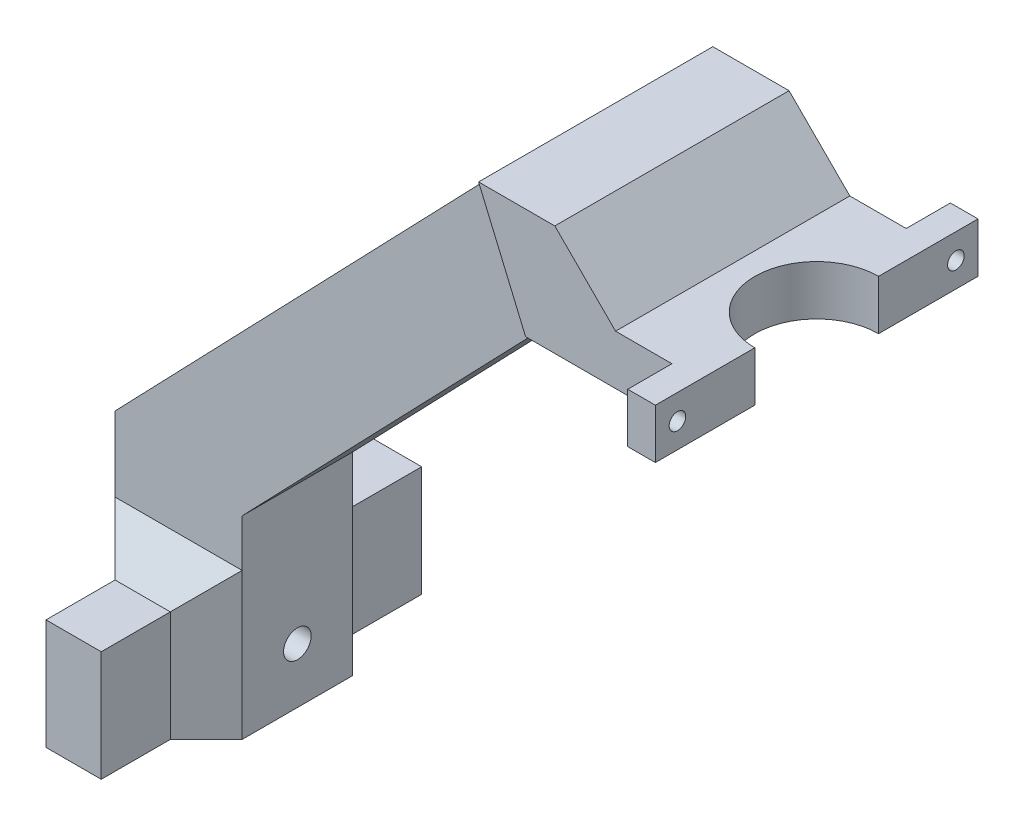
ISO-10303-21;
HEADER;
FILE_DESCRIPTION(('STEP AP214'),'2;1');
FILE_NAME('part.step','',(''),(''),'','','');
FILE_SCHEMA(('AUTOMOTIVE_DESIGN { 1 0 10303 214 1 1 1 1 }'));
ENDSEC;
DATA;
#1=APPLICATION_CONTEXT('core data for automotive mechanical design processes');
#2=APPLICATION_PROTOCOL_DEFINITION('international standard','automotive_design',2000,#1);
#3=PRODUCT_CONTEXT('',#1,'mechanical');
#4=PRODUCT('Part','Part','',(#3));
#5=PRODUCT_RELATED_PRODUCT_CATEGORY('part','',(#4));
#6=PRODUCT_DEFINITION_FORMATION('','',#4);
#7=PRODUCT_DEFINITION_CONTEXT('part definition',#1,'design');
#8=PRODUCT_DEFINITION('design','',#6,#7);
#9=PRODUCT_DEFINITION_SHAPE('','',#8);
#10=(LENGTH_UNIT() NAMED_UNIT(*) SI_UNIT(.MILLI.,.METRE.));
#11=(NAMED_UNIT(*) PLANE_ANGLE_UNIT() SI_UNIT($,.RADIAN.));
#12=(NAMED_UNIT(*) SI_UNIT($,.STERADIAN.) SOLID_ANGLE_UNIT());
#13=UNCERTAINTY_MEASURE_WITH_UNIT(LENGTH_MEASURE(1.E-05),#10,'distance_accuracy_value','');
#14=(GEOMETRIC_REPRESENTATION_CONTEXT(3) GLOBAL_UNCERTAINTY_ASSIGNED_CONTEXT((#13)) GLOBAL_UNIT_ASSIGNED_CONTEXT((#10,
#11,#12)) REPRESENTATION_CONTEXT('',''));
#15=CARTESIAN_POINT('',(0.,0.,0.));
#16=DIRECTION('',(0.,0.,1.));
#17=DIRECTION('',(1.,0.,0.));
#18=AXIS2_PLACEMENT_3D('',#15,#16,#17);
#19=CARTESIAN_POINT('',(0.,0.,-14.224));
#20=DIRECTION('',(0.,0.,1.));
#21=DIRECTION('',(1.,0.,0.));
#22=AXIS2_PLACEMENT_3D('',#19,#20,#21);
#23=PLANE('',#22);
#24=DIRECTION('',(0.,1.,0.));
#25=VECTOR('',#24,1.);
#26=CARTESIAN_POINT('',(44.45,-13.97,-14.224));
#27=LINE('',#26,#25);
#28=CARTESIAN_POINT('',(44.45,-25.4,-14.224));
#29=VERTEX_POINT('',#28);
#30=CARTESIAN_POINT('',(44.45,-13.97,-14.224));
#31=VERTEX_POINT('',#30);
#32=EDGE_CURVE('E66',#29,#31,#27,.T.);
#33=ORIENTED_EDGE('',*,*,#32,.F.);
#34=DIRECTION('',(1.,0.,0.));
#35=VECTOR('',#34,1.);
#36=CARTESIAN_POINT('',(50.8,-25.4,-14.224));
#37=LINE('',#36,#35);
#38=CARTESIAN_POINT('',(10.806439584818,-25.4,-14.224));
#39=VERTEX_POINT('',#38);
#40=EDGE_CURVE('E361',#39,#29,#37,.T.);
#41=ORIENTED_EDGE('',*,*,#40,.F.);
#42=DIRECTION('',(0.391491636974054,-0.920181665857007,0.));
#43=VECTOR('',#42,1.);
#44=CARTESIAN_POINT('',(0.,0.,-14.224));
#45=LINE('',#44,#43);
#46=CARTESIAN_POINT('',(0.,0.,-14.224));
#47=VERTEX_POINT('',#46);
#48=EDGE_CURVE('E357',#47,#39,#45,.T.);
#49=ORIENTED_EDGE('',*,*,#48,.F.);
#50=DIRECTION('',(-1.,0.,0.));
#51=VECTOR('',#50,1.);
#52=CARTESIAN_POINT('',(50.8,0.,-14.224));
#53=LINE('',#52,#51);
#54=CARTESIAN_POINT('',(17.526,0.,-14.224));
#55=VERTEX_POINT('',#54);
#56=EDGE_CURVE('E354',#55,#47,#53,.T.);
#57=ORIENTED_EDGE('',*,*,#56,.F.);
#58=DIRECTION('',(0.707106781186551,-0.707106781186544,0.));
#59=VECTOR('',#58,1.);
#60=CARTESIAN_POINT('',(8.7629999999999,8.76299999999999,-14.224));
#61=LINE('',#60,#59);
#62=CARTESIAN_POINT('',(31.4960000000001,-13.97,-14.224));
#63=VERTEX_POINT('',#62);
#64=EDGE_CURVE('E552',#55,#63,#61,.T.);
#65=ORIENTED_EDGE('',*,*,#64,.T.);
#66=DIRECTION('',(-1.,0.,0.));
#67=VECTOR('',#66,1.);
#68=CARTESIAN_POINT('',(50.8,-13.97,-14.224));
#69=LINE('',#68,#67);
#70=EDGE_CURVE('E324',#31,#63,#69,.T.);
#71=ORIENTED_EDGE('',*,*,#70,.F.);
#72=EDGE_LOOP('',(#33,#41,#49,#57,#65,#71));
#73=FACE_BOUND('',#72,.T.);
#74=ADVANCED_FACE('F47',(#73),#23,.F.);
#75=CARTESIAN_POINT('',(50.8,0.,25.4));
#76=DIRECTION('',(-1.,0.,0.));
#77=DIRECTION('',(0.,0.,1.));
#78=AXIS2_PLACEMENT_3D('',#75,#76,#77);
#79=PLANE('',#78);
#80=CARTESIAN_POINT('',(50.8,-19.685,44.704));
#81=DIRECTION('',(1.,0.,0.));
#82=DIRECTION('',(0.,0.,-1.));
#83=AXIS2_PLACEMENT_3D('',#80,#81,#82);
#84=CIRCLE('',#83,1.905);
#85=CARTESIAN_POINT('',(50.8,-19.685,42.799));
#86=VERTEX_POINT('',#85);
#87=EDGE_CURVE('E583',#86,#86,#84,.T.);
#88=ORIENTED_EDGE('',*,*,#87,.F.);
#89=EDGE_LOOP('',(#88));
#90=FACE_BOUND('',#89,.T.);
#91=DIRECTION('',(0.,0.,-1.));
#92=VECTOR('',#91,1.);
#93=CARTESIAN_POINT('',(50.8,-13.97,39.624));
#94=LINE('',#93,#92);
#95=CARTESIAN_POINT('',(50.8,-13.97,49.784));
#96=VERTEX_POINT('',#95);
#97=CARTESIAN_POINT('',(50.8,-13.97,26.924));
#98=VERTEX_POINT('',#97);
#99=EDGE_CURVE('E321',#96,#98,#94,.T.);
#100=ORIENTED_EDGE('',*,*,#99,.F.);
#101=DIRECTION('',(0.,1.,0.));
#102=VECTOR('',#101,1.);
#103=CARTESIAN_POINT('',(50.8,-13.97,49.784));
#104=LINE('',#103,#102);
#105=CARTESIAN_POINT('',(50.8,-25.4,49.784));
#106=VERTEX_POINT('',#105);
#107=EDGE_CURVE('E296',#106,#96,#104,.T.);
#108=ORIENTED_EDGE('',*,*,#107,.F.);
#109=DIRECTION('',(0.,0.,-1.));
#110=VECTOR('',#109,1.);
#111=CARTESIAN_POINT('',(50.8,-25.4,25.4));
#112=LINE('',#111,#110);
#113=CARTESIAN_POINT('',(50.8,-25.4,26.924));
#114=VERTEX_POINT('',#113);
#115=EDGE_CURVE('E261',#106,#114,#112,.T.);
#116=ORIENTED_EDGE('',*,*,#115,.T.);
#117=DIRECTION('',(0.,1.,0.));
#118=VECTOR('',#117,1.);
#119=CARTESIAN_POINT('',(50.8,-152.4,26.924));
#120=LINE('',#119,#118);
#121=EDGE_CURVE('E339',#114,#98,#120,.T.);
#122=ORIENTED_EDGE('',*,*,#121,.T.);
#123=EDGE_LOOP('',(#100,#108,#116,#122));
#124=FACE_BOUND('',#123,.T.);
#125=ADVANCED_FACE('F601',(#90,#124),#79,.F.);
#126=CARTESIAN_POINT('',(50.8,-19.685,-19.304));
#127=DIRECTION('',(1.,0.,0.));
#128=DIRECTION('',(0.,0.,-1.));
#129=AXIS2_PLACEMENT_3D('',#126,#127,#128);
#130=CIRCLE('',#129,1.905);
#131=CARTESIAN_POINT('',(50.8,-19.685,-21.209));
#132=VERTEX_POINT('',#131);
#133=EDGE_CURVE('E283',#132,#132,#130,.T.);
#134=ORIENTED_EDGE('',*,*,#133,.F.);
#135=EDGE_LOOP('',(#134));
#136=FACE_BOUND('',#135,.T.);
#137=CARTESIAN_POINT('',(50.8,-13.97,-1.524));
#138=VERTEX_POINT('',#137);
#139=CARTESIAN_POINT('',(50.8,-13.97,-24.384));
#140=VERTEX_POINT('',#139);
#141=EDGE_CURVE('E325',#138,#140,#94,.T.);
#142=ORIENTED_EDGE('',*,*,#141,.F.);
#143=DIRECTION('',(0.,1.,0.));
#144=VECTOR('',#143,1.);
#145=CARTESIAN_POINT('',(50.8,-152.4,-1.524));
#146=LINE('',#145,#144);
#147=CARTESIAN_POINT('',(50.8,-25.4,-1.524));
#148=VERTEX_POINT('',#147);
#149=EDGE_CURVE('E256',#138,#148,#146,.F.);
#150=ORIENTED_EDGE('',*,*,#149,.T.);
#151=CARTESIAN_POINT('',(50.8,-25.4,-24.384));
#152=VERTEX_POINT('',#151);
#153=EDGE_CURVE('E249',#148,#152,#112,.T.);
#154=ORIENTED_EDGE('',*,*,#153,.T.);
#155=DIRECTION('',(0.,-1.,0.));
#156=VECTOR('',#155,1.);
#157=CARTESIAN_POINT('',(50.8,-13.97,-24.384));
#158=LINE('',#157,#156);
#159=EDGE_CURVE('E254',#140,#152,#158,.T.);
#160=ORIENTED_EDGE('',*,*,#159,.F.);
#161=EDGE_LOOP('',(#142,#150,#154,#160));
#162=FACE_BOUND('',#161,.T.);
#163=ADVANCED_FACE('F252',(#136,#162),#79,.F.);
#164=CARTESIAN_POINT('',(50.8,-152.4,12.7));
#165=DIRECTION('',(0.,1.,0.));
#166=DIRECTION('',(0.,0.,1.));
#167=AXIS2_PLACEMENT_3D('',#164,#165,#166);
#168=CYLINDRICAL_SURFACE('',#167,14.224);
#169=CARTESIAN_POINT('',(50.8,-13.97,12.7));
#170=DIRECTION('',(0.,1.,0.));
#171=DIRECTION('',(0.,0.,1.));
#172=AXIS2_PLACEMENT_3D('',#169,#170,#171);
#173=CIRCLE('',#172,14.224);
#174=EDGE_CURVE('E530',#98,#138,#173,.F.);
#175=ORIENTED_EDGE('',*,*,#174,.F.);
#176=ORIENTED_EDGE('',*,*,#121,.F.);
#177=CARTESIAN_POINT('',(50.8,-25.4,12.7));
#178=DIRECTION('',(0.,1.,0.));
#179=DIRECTION('',(-1.,0.,0.));
#180=AXIS2_PLACEMENT_3D('',#177,#178,#179);
#181=CIRCLE('',#180,14.224);
#182=EDGE_CURVE('E336',#148,#114,#181,.T.);
#183=ORIENTED_EDGE('',*,*,#182,.F.);
#184=ORIENTED_EDGE('',*,*,#149,.F.);
#185=EDGE_LOOP('',(#175,#176,#183,#184));
#186=FACE_BOUND('',#185,.T.);
#187=ADVANCED_FACE('F600',(#186),#168,.F.);
#188=CARTESIAN_POINT('',(-97.79,-101.6,25.4));
#189=DIRECTION('',(0.720486853359742,-0.693468596358752,0.));
#190=DIRECTION('',(0.693468596358752,0.720486853359742,0.));
#191=AXIS2_PLACEMENT_3D('',#188,#189,#190);
#192=PLANE('',#191);
#193=DIRECTION('',(0.,0.,-1.));
#194=VECTOR('',#193,1.);
#195=CARTESIAN_POINT('',(0.,0.,25.4));
#196=LINE('',#195,#194);
#197=CARTESIAN_POINT('',(0.,0.,39.37));
#198=VERTEX_POINT('',#197);
#199=CARTESIAN_POINT('',(0.,0.,-13.9700000000001));
#200=VERTEX_POINT('',#199);
#201=EDGE_CURVE('E262',#198,#200,#196,.T.);
#202=ORIENTED_EDGE('',*,*,#201,.T.);
#203=DIRECTION('',(0.510298851999777,0.530180625454313,-0.677128928669115));
#204=VECTOR('',#203,1.);
#205=CARTESIAN_POINT('',(-66.5567699068968,-69.1498908123603,74.3459233576985));
#206=LINE('',#205,#204);
#207=CARTESIAN_POINT('',(-10.5280909744155,-10.938276337055,0.));
#208=VERTEX_POINT('',#207);
#209=EDGE_CURVE('E571',#200,#208,#206,.F.);
#210=ORIENTED_EDGE('',*,*,#209,.T.);
#211=DIRECTION('',(-0.693468596358752,-0.720486853359742,0.));
#212=VECTOR('',#211,1.);
#213=CARTESIAN_POINT('',(-97.79,-101.6,0.));
#214=LINE('',#213,#212);
#215=CARTESIAN_POINT('',(-97.79,-101.6,0.));
#216=VERTEX_POINT('',#215);
#217=EDGE_CURVE('E418',#208,#216,#214,.T.);
#218=ORIENTED_EDGE('',*,*,#217,.T.);
#219=DIRECTION('',(0.,0.,-1.));
#220=VECTOR('',#219,1.);
#221=CARTESIAN_POINT('',(-97.79,-101.6,25.4));
#222=LINE('',#221,#220);
#223=CARTESIAN_POINT('',(-97.79,-101.6,25.4));
#224=VERTEX_POINT('',#223);
#225=EDGE_CURVE('E486',#224,#216,#222,.T.);
#226=ORIENTED_EDGE('',*,*,#225,.F.);
#227=DIRECTION('',(-0.693468596358752,-0.720486853359742,0.));
#228=VECTOR('',#227,1.);
#229=CARTESIAN_POINT('',(-97.79,-101.6,25.4));
#230=LINE('',#229,#228);
#231=CARTESIAN_POINT('',(-10.5280909744156,-10.9382763370552,25.4));
#232=VERTEX_POINT('',#231);
#233=EDGE_CURVE('E434',#232,#224,#230,.T.);
#234=ORIENTED_EDGE('',*,*,#233,.F.);
#235=DIRECTION('',(0.510298851999781,0.530180625454318,0.677128928669108));
#236=VECTOR('',#235,1.);
#237=CARTESIAN_POINT('',(-57.7801017870232,-60.0312745839202,-37.2999322722675));
#238=LINE('',#237,#236);
#239=EDGE_CURVE('E58',#232,#198,#238,.T.);
#240=ORIENTED_EDGE('',*,*,#239,.T.);
#241=EDGE_LOOP('',(#202,#210,#218,#226,#234,#240));
#242=FACE_BOUND('',#241,.T.);
#243=ADVANCED_FACE('F608',(#242),#192,.F.);
#244=CARTESIAN_POINT('',(-97.79,-101.6,25.4));
#245=DIRECTION('',(1.,0.,0.));
#246=DIRECTION('',(0.,1.,0.));
#247=AXIS2_PLACEMENT_3D('',#244,#245,#246);
#248=PLANE('',#247);
#249=CARTESIAN_POINT('',(-97.79,-139.7,12.7));
#250=DIRECTION('',(-1.,0.,0.));
#251=DIRECTION('',(0.,0.,1.));
#252=AXIS2_PLACEMENT_3D('',#249,#250,#251);
#253=CIRCLE('',#252,3.175);
#254=CARTESIAN_POINT('',(-97.79,-139.7,15.875));
#255=VERTEX_POINT('',#254);
#256=EDGE_CURVE('E375',#255,#255,#253,.T.);
#257=ORIENTED_EDGE('',*,*,#256,.F.);
#258=EDGE_LOOP('',(#257));
#259=FACE_BOUND('',#258,.T.);
#260=DIRECTION('',(0.,-1.,0.));
#261=VECTOR('',#260,1.);
#262=CARTESIAN_POINT('',(-97.79,-101.6,0.));
#263=LINE('',#262,#261);
#264=CARTESIAN_POINT('',(-97.79,-118.745,0.));
#265=VERTEX_POINT('',#264);
#266=EDGE_CURVE('E455',#216,#265,#263,.T.);
#267=ORIENTED_EDGE('',*,*,#266,.T.);
#268=CARTESIAN_POINT('',(-97.79,-152.4,0.));
#269=VERTEX_POINT('',#268);
#270=EDGE_CURVE('E454',#265,#269,#263,.T.);
#271=ORIENTED_EDGE('',*,*,#270,.T.);
#272=DIRECTION('',(0.,0.,-1.));
#273=VECTOR('',#272,1.);
#274=CARTESIAN_POINT('',(-97.79,-152.4,25.4));
#275=LINE('',#274,#273);
#276=CARTESIAN_POINT('',(-97.79,-152.4,25.4));
#277=VERTEX_POINT('',#276);
#278=EDGE_CURVE('E482',#277,#269,#275,.T.);
#279=ORIENTED_EDGE('',*,*,#278,.F.);
#280=DIRECTION('',(0.,-1.,0.));
#281=VECTOR('',#280,1.);
#282=CARTESIAN_POINT('',(-97.79,-101.6,25.4));
#283=LINE('',#282,#281);
#284=CARTESIAN_POINT('',(-97.79,-118.745,25.4));
#285=VERTEX_POINT('',#284);
#286=EDGE_CURVE('E437',#285,#277,#283,.T.);
#287=ORIENTED_EDGE('',*,*,#286,.F.);
#288=EDGE_CURVE('E439',#224,#285,#283,.T.);
#289=ORIENTED_EDGE('',*,*,#288,.F.);
#290=ORIENTED_EDGE('',*,*,#225,.T.);
#291=EDGE_LOOP('',(#267,#271,#279,#287,#289,#290));
#292=FACE_BOUND('',#291,.T.);
#293=ADVANCED_FACE('F696',(#259,#292),#248,.F.);
#294=CARTESIAN_POINT('',(-97.79,-152.4,25.4));
#295=DIRECTION('',(0.,1.,0.));
#296=DIRECTION('',(0.,0.,1.));
#297=AXIS2_PLACEMENT_3D('',#294,#295,#296);
#298=PLANE('',#297);
#299=DIRECTION('',(0.,0.,-1.));
#300=VECTOR('',#299,1.);
#301=CARTESIAN_POINT('',(-68.58,-152.4,25.4));
#302=LINE('',#301,#300);
#303=CARTESIAN_POINT('',(-68.58,-152.4,25.4));
#304=VERTEX_POINT('',#303);
#305=CARTESIAN_POINT('',(-68.58,-152.4,0.));
#306=VERTEX_POINT('',#305);
#307=EDGE_CURVE('E478',#304,#306,#302,.T.);
#308=ORIENTED_EDGE('',*,*,#307,.F.);
#309=DIRECTION('',(-0.707106781186552,0.,0.707106781186543));
#310=VECTOR('',#309,1.);
#311=CARTESIAN_POINT('',(-83.1850000000001,-152.4,40.005));
#312=LINE('',#311,#310);
#313=CARTESIAN_POINT('',(-76.835,-152.4,33.655));
#314=VERTEX_POINT('',#313);
#315=EDGE_CURVE('E521',#304,#314,#312,.T.);
#316=ORIENTED_EDGE('',*,*,#315,.T.);
#317=DIRECTION('',(0.,0.,1.));
#318=VECTOR('',#317,1.);
#319=CARTESIAN_POINT('',(-76.835,-152.4,-24.13));
#320=LINE('',#319,#318);
#321=CARTESIAN_POINT('',(-76.835,-152.4,49.53));
#322=VERTEX_POINT('',#321);
#323=EDGE_CURVE('E429',#314,#322,#320,.T.);
#324=ORIENTED_EDGE('',*,*,#323,.T.);
#325=DIRECTION('',(1.,0.,0.));
#326=VECTOR('',#325,1.);
#327=CARTESIAN_POINT('',(-89.535,-152.4,49.53));
#328=LINE('',#327,#326);
#329=CARTESIAN_POINT('',(-89.535,-152.4,49.53));
#330=VERTEX_POINT('',#329);
#331=EDGE_CURVE('E385',#330,#322,#328,.T.);
#332=ORIENTED_EDGE('',*,*,#331,.F.);
#333=DIRECTION('',(0.,0.,1.));
#334=VECTOR('',#333,1.);
#335=CARTESIAN_POINT('',(-89.535,-152.4,-24.13));
#336=LINE('',#335,#334);
#337=CARTESIAN_POINT('',(-89.535,-152.4,33.655));
#338=VERTEX_POINT('',#337);
#339=EDGE_CURVE('E413',#338,#330,#336,.T.);
#340=ORIENTED_EDGE('',*,*,#339,.F.);
#341=DIRECTION('',(-0.707106781186551,0.,-0.707106781186544));
#342=VECTOR('',#341,1.);
#343=CARTESIAN_POINT('',(-97.79,-152.4,25.4));
#344=LINE('',#343,#342);
#345=EDGE_CURVE('E518',#338,#277,#344,.T.);
#346=ORIENTED_EDGE('',*,*,#345,.T.);
#347=ORIENTED_EDGE('',*,*,#278,.T.);
#348=DIRECTION('',(-0.707106781186543,0.,0.707106781186552));
#349=VECTOR('',#348,1.);
#350=CARTESIAN_POINT('',(-110.49,-152.4,12.7000000000002));
#351=LINE('',#350,#349);
#352=CARTESIAN_POINT('',(-89.535,-152.4,-8.25500000000007));
#353=VERTEX_POINT('',#352);
#354=EDGE_CURVE('E524',#269,#353,#351,.F.);
#355=ORIENTED_EDGE('',*,*,#354,.T.);
#356=CARTESIAN_POINT('',(-89.535,-152.4,-24.13));
#357=VERTEX_POINT('',#356);
#358=EDGE_CURVE('E430',#357,#353,#336,.T.);
#359=ORIENTED_EDGE('',*,*,#358,.F.);
#360=DIRECTION('',(1.,0.,0.));
#361=VECTOR('',#360,1.);
#362=CARTESIAN_POINT('',(-89.535,-152.4,-24.13));
#363=LINE('',#362,#361);
#364=CARTESIAN_POINT('',(-76.835,-152.4,-24.13));
#365=VERTEX_POINT('',#364);
#366=EDGE_CURVE('E401',#357,#365,#363,.T.);
#367=ORIENTED_EDGE('',*,*,#366,.T.);
#368=CARTESIAN_POINT('',(-76.835,-152.4,-8.25500000000007));
#369=VERTEX_POINT('',#368);
#370=EDGE_CURVE('E425',#365,#369,#320,.T.);
#371=ORIENTED_EDGE('',*,*,#370,.T.);
#372=DIRECTION('',(-0.707106781186543,0.,-0.707106781186552));
#373=VECTOR('',#372,1.);
#374=CARTESIAN_POINT('',(-70.4849999999999,-152.4,-1.90499999999983));
#375=LINE('',#374,#373);
#376=EDGE_CURVE('E527',#369,#306,#375,.F.);
#377=ORIENTED_EDGE('',*,*,#376,.T.);
#378=EDGE_LOOP('',(#308,#316,#324,#332,#340,#346,#347,#355,#359,#367,#371,#377));
#379=FACE_BOUND('',#378,.T.);
#380=ADVANCED_FACE('F885',(#379),#298,.F.);
#381=CARTESIAN_POINT('',(-68.58,-152.4,25.4));
#382=DIRECTION('',(-1.,0.,0.));
#383=DIRECTION('',(0.,0.,1.));
#384=AXIS2_PLACEMENT_3D('',#381,#382,#383);
#385=PLANE('',#384);
#386=CARTESIAN_POINT('',(-68.58,-139.7,12.7));
#387=DIRECTION('',(-1.,0.,0.));
#388=DIRECTION('',(0.,0.,1.));
#389=AXIS2_PLACEMENT_3D('',#386,#387,#388);
#390=CIRCLE('',#389,3.175);
#391=CARTESIAN_POINT('',(-68.58,-139.7,15.875));
#392=VERTEX_POINT('',#391);
#393=EDGE_CURVE('E379',#392,#392,#390,.T.);
#394=ORIENTED_EDGE('',*,*,#393,.T.);
#395=EDGE_LOOP('',(#394));
#396=FACE_BOUND('',#395,.T.);
#397=DIRECTION('',(0.,1.,0.));
#398=VECTOR('',#397,1.);
#399=CARTESIAN_POINT('',(-68.58,-152.4,0.));
#400=LINE('',#399,#398);
#401=CARTESIAN_POINT('',(-68.58,-118.745,0.));
#402=VERTEX_POINT('',#401);
#403=EDGE_CURVE('E460',#306,#402,#400,.T.);
#404=ORIENTED_EDGE('',*,*,#403,.T.);
#405=CARTESIAN_POINT('',(-68.58,-107.87941775046,0.));
#406=VERTEX_POINT('',#405);
#407=EDGE_CURVE('E459',#402,#406,#400,.T.);
#408=ORIENTED_EDGE('',*,*,#407,.T.);
#409=DIRECTION('',(0.,0.,-1.));
#410=VECTOR('',#409,1.);
#411=CARTESIAN_POINT('',(-68.58,-107.87941775046,25.4));
#412=LINE('',#411,#410);
#413=CARTESIAN_POINT('',(-68.58,-107.87941775046,25.4));
#414=VERTEX_POINT('',#413);
#415=EDGE_CURVE('E474',#414,#406,#412,.T.);
#416=ORIENTED_EDGE('',*,*,#415,.F.);
#417=DIRECTION('',(0.,1.,0.));
#418=VECTOR('',#417,1.);
#419=CARTESIAN_POINT('',(-68.58,-152.4,25.4));
#420=LINE('',#419,#418);
#421=CARTESIAN_POINT('',(-68.58,-118.745,25.4));
#422=VERTEX_POINT('',#421);
#423=EDGE_CURVE('E443',#422,#414,#420,.T.);
#424=ORIENTED_EDGE('',*,*,#423,.F.);
#425=EDGE_CURVE('E444',#304,#422,#420,.T.);
#426=ORIENTED_EDGE('',*,*,#425,.F.);
#427=ORIENTED_EDGE('',*,*,#307,.T.);
#428=EDGE_LOOP('',(#404,#408,#416,#424,#426,#427));
#429=FACE_BOUND('',#428,.T.);
#430=ADVANCED_FACE('F841',(#396,#429),#385,.F.);
#431=CARTESIAN_POINT('',(10.806439584818,-25.4,25.4));
#432=DIRECTION('',(-0.720486853359742,0.693468596358752,0.));
#433=DIRECTION('',(-0.693468596358752,-0.720486853359742,0.));
#434=AXIS2_PLACEMENT_3D('',#431,#432,#433);
#435=PLANE('',#434);
#436=DIRECTION('',(0.693468596358752,0.720486853359742,0.));
#437=VECTOR('',#436,1.);
#438=CARTESIAN_POINT('',(10.806439584818,-25.4,0.));
#439=LINE('',#438,#437);
#440=CARTESIAN_POINT('',(0.278348610402596,-36.338276337055,0.));
#441=VERTEX_POINT('',#440);
#442=EDGE_CURVE('E438',#406,#441,#439,.T.);
#443=ORIENTED_EDGE('',*,*,#442,.T.);
#444=DIRECTION('',(-0.510298851999776,-0.530180625454313,0.677128928669115));
#445=VECTOR('',#444,1.);
#446=CARTESIAN_POINT('',(-2.79739600098741,-39.5338551540836,4.08128618241773));
#447=LINE('',#446,#445);
#448=CARTESIAN_POINT('',(10.806439584818,-25.4,-13.9700000000001));
#449=VERTEX_POINT('',#448);
#450=EDGE_CURVE('E574',#441,#449,#447,.F.);
#451=ORIENTED_EDGE('',*,*,#450,.T.);
#452=DIRECTION('',(0.,0.,-1.));
#453=VECTOR('',#452,1.);
#454=CARTESIAN_POINT('',(10.806439584818,-25.4,25.4));
#455=LINE('',#454,#453);
#456=CARTESIAN_POINT('',(10.806439584818,-25.4,39.37));
#457=VERTEX_POINT('',#456);
#458=EDGE_CURVE('E471',#457,#449,#455,.T.);
#459=ORIENTED_EDGE('',*,*,#458,.F.);
#460=DIRECTION('',(-0.510298851999781,-0.530180625454318,-0.677128928669108));
#461=VECTOR('',#460,1.);
#462=CARTESIAN_POINT('',(5.9792721188871,-30.4152389256425,32.9647049030132));
#463=LINE('',#462,#461);
#464=CARTESIAN_POINT('',(0.278348610402461,-36.3382763370552,25.4));
#465=VERTEX_POINT('',#464);
#466=EDGE_CURVE('E11',#457,#465,#463,.T.);
#467=ORIENTED_EDGE('',*,*,#466,.T.);
#468=DIRECTION('',(0.693468596358752,0.720486853359742,0.));
#469=VECTOR('',#468,1.);
#470=CARTESIAN_POINT('',(10.806439584818,-25.4,25.4));
#471=LINE('',#470,#469);
#472=EDGE_CURVE('E448',#414,#465,#471,.T.);
#473=ORIENTED_EDGE('',*,*,#472,.F.);
#474=ORIENTED_EDGE('',*,*,#415,.T.);
#475=EDGE_LOOP('',(#443,#451,#459,#467,#473,#474));
#476=FACE_BOUND('',#475,.T.);
#477=ADVANCED_FACE('F670',(#476),#435,.F.);
#478=CARTESIAN_POINT('',(50.8,-25.4,25.4));
#479=DIRECTION('',(0.,1.,0.));
#480=DIRECTION('',(-1.,0.,0.));
#481=AXIS2_PLACEMENT_3D('',#478,#479,#480);
#482=PLANE('',#481);
#483=ORIENTED_EDGE('',*,*,#153,.F.);
#484=ORIENTED_EDGE('',*,*,#182,.T.);
#485=ORIENTED_EDGE('',*,*,#115,.F.);
#486=DIRECTION('',(1.,0.,0.));
#487=VECTOR('',#486,1.);
#488=CARTESIAN_POINT('',(50.8,-25.4,49.784));
#489=LINE('',#488,#487);
#490=CARTESIAN_POINT('',(44.45,-25.4,49.784));
#491=VERTEX_POINT('',#490);
#492=EDGE_CURVE('E306',#491,#106,#489,.T.);
#493=ORIENTED_EDGE('',*,*,#492,.F.);
#494=DIRECTION('',(0.,0.,-1.));
#495=VECTOR('',#494,1.);
#496=CARTESIAN_POINT('',(44.45,-25.4,49.784));
#497=LINE('',#496,#495);
#498=CARTESIAN_POINT('',(44.45,-25.4,39.624));
#499=VERTEX_POINT('',#498);
#500=EDGE_CURVE('E310',#491,#499,#497,.T.);
#501=ORIENTED_EDGE('',*,*,#500,.T.);
#502=DIRECTION('',(1.,0.,0.));
#503=VECTOR('',#502,1.);
#504=CARTESIAN_POINT('',(50.8,-25.4,39.624));
#505=LINE('',#504,#503);
#506=CARTESIAN_POINT('',(10.806439584818,-25.4,39.624));
#507=VERTEX_POINT('',#506);
#508=EDGE_CURVE('E351',#507,#499,#505,.T.);
#509=ORIENTED_EDGE('',*,*,#508,.F.);
#510=DIRECTION('',(0.,0.,1.));
#511=VECTOR('',#510,1.);
#512=CARTESIAN_POINT('',(10.806439584818,-25.4,-14.224));
#513=LINE('',#512,#511);
#514=EDGE_CURVE('E370',#457,#507,#513,.T.);
#515=ORIENTED_EDGE('',*,*,#514,.F.);
#516=ORIENTED_EDGE('',*,*,#458,.T.);
#517=EDGE_CURVE('E365',#39,#449,#513,.T.);
#518=ORIENTED_EDGE('',*,*,#517,.F.);
#519=ORIENTED_EDGE('',*,*,#40,.T.);
#520=DIRECTION('',(0.,0.,1.));
#521=VECTOR('',#520,1.);
#522=CARTESIAN_POINT('',(44.45,-25.4,-24.384));
#523=LINE('',#522,#521);
#524=CARTESIAN_POINT('',(44.45,-25.4,-24.384));
#525=VERTEX_POINT('',#524);
#526=EDGE_CURVE('E268',#525,#29,#523,.T.);
#527=ORIENTED_EDGE('',*,*,#526,.F.);
#528=DIRECTION('',(-1.,0.,0.));
#529=VECTOR('',#528,1.);
#530=CARTESIAN_POINT('',(50.8,-25.4,-24.384));
#531=LINE('',#530,#529);
#532=EDGE_CURVE('E265',#152,#525,#531,.T.);
#533=ORIENTED_EDGE('',*,*,#532,.F.);
#534=EDGE_LOOP('',(#483,#484,#485,#493,#501,#509,#515,#516,#518,#519,#527,#533));
#535=FACE_BOUND('',#534,.T.);
#536=ADVANCED_FACE('F266',(#535),#482,.F.);
#537=CARTESIAN_POINT('',(0.,0.,25.4));
#538=DIRECTION('',(0.,-1.,0.));
#539=DIRECTION('',(0.,0.,-1.));
#540=AXIS2_PLACEMENT_3D('',#537,#538,#539);
#541=PLANE('',#540);
#542=DIRECTION('',(-1.,0.,0.));
#543=VECTOR('',#542,1.);
#544=CARTESIAN_POINT('',(50.8,0.,39.624));
#545=LINE('',#544,#543);
#546=CARTESIAN_POINT('',(17.526,0.,39.624));
#547=VERTEX_POINT('',#546);
#548=CARTESIAN_POINT('',(0.,0.,39.624));
#549=VERTEX_POINT('',#548);
#550=EDGE_CURVE('E343',#547,#549,#545,.T.);
#551=ORIENTED_EDGE('',*,*,#550,.F.);
#552=DIRECTION('',(0.,0.,1.));
#553=VECTOR('',#552,1.);
#554=CARTESIAN_POINT('',(17.526,0.,39.624));
#555=LINE('',#554,#553);
#556=EDGE_CURVE('E320',#55,#547,#555,.T.);
#557=ORIENTED_EDGE('',*,*,#556,.F.);
#558=ORIENTED_EDGE('',*,*,#56,.T.);
#559=DIRECTION('',(0.,0.,1.));
#560=VECTOR('',#559,1.);
#561=CARTESIAN_POINT('',(0.,0.,-14.224));
#562=LINE('',#561,#560);
#563=EDGE_CURVE('E371',#47,#200,#562,.T.);
#564=ORIENTED_EDGE('',*,*,#563,.T.);
#565=ORIENTED_EDGE('',*,*,#201,.F.);
#566=EDGE_CURVE('E364',#198,#549,#562,.T.);
#567=ORIENTED_EDGE('',*,*,#566,.T.);
#568=EDGE_LOOP('',(#551,#557,#558,#564,#565,#567));
#569=FACE_BOUND('',#568,.T.);
#570=ADVANCED_FACE('F661',(#569),#541,.F.);
#571=CARTESIAN_POINT('',(0.,0.,25.4));
#572=DIRECTION('',(0.,0.,-1.));
#573=DIRECTION('',(-1.,0.,0.));
#574=AXIS2_PLACEMENT_3D('',#571,#572,#573);
#575=PLANE('',#574);
#576=ORIENTED_EDGE('',*,*,#472,.T.);
#577=DIRECTION('',(-0.391491636974054,0.920181665857007,0.));
#578=VECTOR('',#577,1.);
#579=CARTESIAN_POINT('',(-12.8549378720225,-5.46913816852758,25.4));
#580=LINE('',#579,#578);
#581=EDGE_CURVE('E563',#465,#232,#580,.T.);
#582=ORIENTED_EDGE('',*,*,#581,.T.);
#583=ORIENTED_EDGE('',*,*,#233,.T.);
#584=ORIENTED_EDGE('',*,*,#288,.T.);
#585=DIRECTION('',(1.,0.,0.));
#586=VECTOR('',#585,1.);
#587=CARTESIAN_POINT('',(2.5951463200613E-13,-118.745,25.4));
#588=LINE('',#587,#586);
#589=EDGE_CURVE('E490',#285,#422,#588,.T.);
#590=ORIENTED_EDGE('',*,*,#589,.T.);
#591=ORIENTED_EDGE('',*,*,#423,.T.);
#592=EDGE_LOOP('',(#576,#582,#583,#584,#590,#591));
#593=FACE_BOUND('',#592,.T.);
#594=ADVANCED_FACE('F658',(#593),#575,.F.);
#595=CARTESIAN_POINT('',(0.,0.,0.));
#596=DIRECTION('',(0.,0.,-1.));
#597=DIRECTION('',(-1.,0.,0.));
#598=AXIS2_PLACEMENT_3D('',#595,#596,#597);
#599=PLANE('',#598);
#600=ORIENTED_EDGE('',*,*,#217,.F.);
#601=DIRECTION('',(0.391491636974054,-0.920181665857007,0.));
#602=VECTOR('',#601,1.);
#603=CARTESIAN_POINT('',(-2.04849828720429,-30.8691381685275,0.));
#604=LINE('',#603,#602);
#605=EDGE_CURVE('E560',#208,#441,#604,.T.);
#606=ORIENTED_EDGE('',*,*,#605,.T.);
#607=ORIENTED_EDGE('',*,*,#442,.F.);
#608=ORIENTED_EDGE('',*,*,#407,.F.);
#609=DIRECTION('',(-1.,0.,0.));
#610=VECTOR('',#609,1.);
#611=CARTESIAN_POINT('',(-89.535,-118.745,0.));
#612=LINE('',#611,#610);
#613=EDGE_CURVE('E509',#402,#265,#612,.T.);
#614=ORIENTED_EDGE('',*,*,#613,.T.);
#615=ORIENTED_EDGE('',*,*,#266,.F.);
#616=EDGE_LOOP('',(#600,#606,#607,#608,#614,#615));
#617=FACE_BOUND('',#616,.T.);
#618=ADVANCED_FACE('F643',(#617),#599,.T.);
#619=CARTESIAN_POINT('',(0.,0.,-24.13));
#620=DIRECTION('',(0.,0.,-1.));
#621=DIRECTION('',(-1.,0.,0.));
#622=AXIS2_PLACEMENT_3D('',#619,#620,#621);
#623=PLANE('',#622);
#624=DIRECTION('',(0.,-1.,0.));
#625=VECTOR('',#624,1.);
#626=CARTESIAN_POINT('',(-89.535,-152.4,-24.13));
#627=LINE('',#626,#625);
#628=CARTESIAN_POINT('',(-89.535,-127.,-24.13));
#629=VERTEX_POINT('',#628);
#630=EDGE_CURVE('E397',#629,#357,#627,.T.);
#631=ORIENTED_EDGE('',*,*,#630,.F.);
#632=DIRECTION('',(-1.,0.,0.));
#633=VECTOR('',#632,1.);
#634=CARTESIAN_POINT('',(-89.535,-127.,-24.13));
#635=LINE('',#634,#633);
#636=CARTESIAN_POINT('',(-76.835,-127.,-24.13));
#637=VERTEX_POINT('',#636);
#638=EDGE_CURVE('E409',#637,#629,#635,.T.);
#639=ORIENTED_EDGE('',*,*,#638,.F.);
#640=DIRECTION('',(0.,1.,0.));
#641=VECTOR('',#640,1.);
#642=CARTESIAN_POINT('',(-76.835,-152.4,-24.13));
#643=LINE('',#642,#641);
#644=EDGE_CURVE('E405',#365,#637,#643,.T.);
#645=ORIENTED_EDGE('',*,*,#644,.F.);
#646=ORIENTED_EDGE('',*,*,#366,.F.);
#647=EDGE_LOOP('',(#631,#639,#645,#646));
#648=FACE_BOUND('',#647,.T.);
#649=ADVANCED_FACE('F639',(#648),#623,.T.);
#650=CARTESIAN_POINT('',(-76.835,-152.4,-24.13));
#651=DIRECTION('',(1.,0.,0.));
#652=DIRECTION('',(0.,1.,0.));
#653=AXIS2_PLACEMENT_3D('',#650,#651,#652);
#654=PLANE('',#653);
#655=DIRECTION('',(0.,0.,1.));
#656=VECTOR('',#655,1.);
#657=CARTESIAN_POINT('',(-76.835,-127.,-24.13));
#658=LINE('',#657,#656);
#659=CARTESIAN_POINT('',(-76.835,-127.,-8.25500000000007));
#660=VERTEX_POINT('',#659);
#661=EDGE_CURVE('E420',#637,#660,#658,.T.);
#662=ORIENTED_EDGE('',*,*,#661,.T.);
#663=DIRECTION('',(0.,-1.,0.));
#664=VECTOR('',#663,1.);
#665=CARTESIAN_POINT('',(-76.835,-152.4,-8.25500000000007));
#666=LINE('',#665,#664);
#667=EDGE_CURVE('E515',#660,#369,#666,.T.);
#668=ORIENTED_EDGE('',*,*,#667,.T.);
#669=ORIENTED_EDGE('',*,*,#370,.F.);
#670=ORIENTED_EDGE('',*,*,#644,.T.);
#671=EDGE_LOOP('',(#662,#668,#669,#670));
#672=FACE_BOUND('',#671,.T.);
#673=ADVANCED_FACE('F642',(#672),#654,.T.);
#674=CARTESIAN_POINT('',(-89.535,-127.,-24.13));
#675=DIRECTION('',(0.,1.,0.));
#676=DIRECTION('',(-1.,0.,0.));
#677=AXIS2_PLACEMENT_3D('',#674,#675,#676);
#678=PLANE('',#677);
#679=DIRECTION('',(0.,0.,1.));
#680=VECTOR('',#679,1.);
#681=CARTESIAN_POINT('',(-89.535,-127.,-24.13));
#682=LINE('',#681,#680);
#683=CARTESIAN_POINT('',(-89.535,-127.,-8.25500000000007));
#684=VERTEX_POINT('',#683);
#685=EDGE_CURVE('E414',#629,#684,#682,.T.);
#686=ORIENTED_EDGE('',*,*,#685,.T.);
#687=DIRECTION('',(1.,0.,0.));
#688=VECTOR('',#687,1.);
#689=CARTESIAN_POINT('',(-76.835,-127.,-8.25500000000007));
#690=LINE('',#689,#688);
#691=EDGE_CURVE('E512',#684,#660,#690,.T.);
#692=ORIENTED_EDGE('',*,*,#691,.T.);
#693=ORIENTED_EDGE('',*,*,#661,.F.);
#694=ORIENTED_EDGE('',*,*,#638,.T.);
#695=EDGE_LOOP('',(#686,#692,#693,#694));
#696=FACE_BOUND('',#695,.T.);
#697=ADVANCED_FACE('F645',(#696),#678,.T.);
#698=CARTESIAN_POINT('',(-89.535,-152.4,-24.13));
#699=DIRECTION('',(-1.,0.,0.));
#700=DIRECTION('',(0.,0.,1.));
#701=AXIS2_PLACEMENT_3D('',#698,#699,#700);
#702=PLANE('',#701);
#703=ORIENTED_EDGE('',*,*,#358,.T.);
#704=DIRECTION('',(0.,1.,0.));
#705=VECTOR('',#704,1.);
#706=CARTESIAN_POINT('',(-89.535,-127.,-8.25500000000007));
#707=LINE('',#706,#705);
#708=EDGE_CURVE('E505',#353,#684,#707,.T.);
#709=ORIENTED_EDGE('',*,*,#708,.T.);
#710=ORIENTED_EDGE('',*,*,#685,.F.);
#711=ORIENTED_EDGE('',*,*,#630,.T.);
#712=EDGE_LOOP('',(#703,#709,#710,#711));
#713=FACE_BOUND('',#712,.T.);
#714=ADVANCED_FACE('F648',(#713),#702,.T.);
#715=CARTESIAN_POINT('',(-89.535,-127.,33.655));
#716=VERTEX_POINT('',#715);
#717=CARTESIAN_POINT('',(-89.535,-127.,49.53));
#718=VERTEX_POINT('',#717);
#719=EDGE_CURVE('E419',#716,#718,#682,.T.);
#720=ORIENTED_EDGE('',*,*,#719,.F.);
#721=DIRECTION('',(0.,-1.,0.));
#722=VECTOR('',#721,1.);
#723=CARTESIAN_POINT('',(-89.535,-152.4,33.655));
#724=LINE('',#723,#722);
#725=EDGE_CURVE('E496',#716,#338,#724,.T.);
#726=ORIENTED_EDGE('',*,*,#725,.T.);
#727=ORIENTED_EDGE('',*,*,#339,.T.);
#728=DIRECTION('',(0.,-1.,0.));
#729=VECTOR('',#728,1.);
#730=CARTESIAN_POINT('',(-89.535,-152.4,49.53));
#731=LINE('',#730,#729);
#732=EDGE_CURVE('E381',#718,#330,#731,.T.);
#733=ORIENTED_EDGE('',*,*,#732,.F.);
#734=EDGE_LOOP('',(#720,#726,#727,#733));
#735=FACE_BOUND('',#734,.T.);
#736=ADVANCED_FACE('F656',(#735),#702,.T.);
#737=CARTESIAN_POINT('',(-76.835,-127.,33.655));
#738=VERTEX_POINT('',#737);
#739=CARTESIAN_POINT('',(-76.835,-127.,49.53));
#740=VERTEX_POINT('',#739);
#741=EDGE_CURVE('E424',#738,#740,#658,.T.);
#742=ORIENTED_EDGE('',*,*,#741,.F.);
#743=DIRECTION('',(-1.,0.,0.));
#744=VECTOR('',#743,1.);
#745=CARTESIAN_POINT('',(-89.535,-127.,33.655));
#746=LINE('',#745,#744);
#747=EDGE_CURVE('E499',#738,#716,#746,.T.);
#748=ORIENTED_EDGE('',*,*,#747,.T.);
#749=ORIENTED_EDGE('',*,*,#719,.T.);
#750=DIRECTION('',(-1.,0.,0.));
#751=VECTOR('',#750,1.);
#752=CARTESIAN_POINT('',(-89.535,-127.,49.53));
#753=LINE('',#752,#751);
#754=EDGE_CURVE('E393',#740,#718,#753,.T.);
#755=ORIENTED_EDGE('',*,*,#754,.F.);
#756=EDGE_LOOP('',(#742,#748,#749,#755));
#757=FACE_BOUND('',#756,.T.);
#758=ADVANCED_FACE('F650',(#757),#678,.T.);
#759=ORIENTED_EDGE('',*,*,#323,.F.);
#760=DIRECTION('',(0.,1.,0.));
#761=VECTOR('',#760,1.);
#762=CARTESIAN_POINT('',(-76.835,-152.4,33.655));
#763=LINE('',#762,#761);
#764=EDGE_CURVE('E502',#314,#738,#763,.T.);
#765=ORIENTED_EDGE('',*,*,#764,.T.);
#766=ORIENTED_EDGE('',*,*,#741,.T.);
#767=DIRECTION('',(0.,1.,0.));
#768=VECTOR('',#767,1.);
#769=CARTESIAN_POINT('',(-76.835,-152.4,49.53));
#770=LINE('',#769,#768);
#771=EDGE_CURVE('E389',#322,#740,#770,.T.);
#772=ORIENTED_EDGE('',*,*,#771,.F.);
#773=EDGE_LOOP('',(#759,#765,#766,#772));
#774=FACE_BOUND('',#773,.T.);
#775=ADVANCED_FACE('F637',(#774),#654,.T.);
#776=CARTESIAN_POINT('',(0.,0.,49.53));
#777=DIRECTION('',(0.,0.,-1.));
#778=DIRECTION('',(-1.,0.,0.));
#779=AXIS2_PLACEMENT_3D('',#776,#777,#778);
#780=PLANE('',#779);
#781=ORIENTED_EDGE('',*,*,#732,.T.);
#782=ORIENTED_EDGE('',*,*,#331,.T.);
#783=ORIENTED_EDGE('',*,*,#771,.T.);
#784=ORIENTED_EDGE('',*,*,#754,.T.);
#785=EDGE_LOOP('',(#781,#782,#783,#784));
#786=FACE_BOUND('',#785,.T.);
#787=ADVANCED_FACE('F633',(#786),#780,.F.);
#788=CARTESIAN_POINT('',(50.8,-139.7,12.7));
#789=DIRECTION('',(-1.,0.,0.));
#790=DIRECTION('',(0.,0.,1.));
#791=AXIS2_PLACEMENT_3D('',#788,#789,#790);
#792=CYLINDRICAL_SURFACE('',#791,3.175);
#793=ORIENTED_EDGE('',*,*,#256,.T.);
#794=EDGE_LOOP('',(#793));
#795=FACE_BOUND('',#794,.T.);
#796=ORIENTED_EDGE('',*,*,#393,.F.);
#797=EDGE_LOOP('',(#796));
#798=FACE_BOUND('',#797,.T.);
#799=ADVANCED_FACE('F629',(#795,#798),#792,.F.);
#800=CARTESIAN_POINT('',(-68.58,0.,25.4));
#801=DIRECTION('',(-0.707106781186543,0.,-0.707106781186552));
#802=DIRECTION('',(0.,-1.,0.));
#803=AXIS2_PLACEMENT_3D('',#800,#801,#802);
#804=PLANE('',#803);
#805=ORIENTED_EDGE('',*,*,#315,.F.);
#806=ORIENTED_EDGE('',*,*,#425,.T.);
#807=DIRECTION('',(-0.577350269189628,-0.577350269189628,0.577350269189621));
#808=VECTOR('',#807,1.);
#809=CARTESIAN_POINT('',(-28.998333333333,-79.163333333333,-14.1816666666665));
#810=LINE('',#809,#808);
#811=EDGE_CURVE('E380',#738,#422,#810,.F.);
#812=ORIENTED_EDGE('',*,*,#811,.F.);
#813=ORIENTED_EDGE('',*,*,#764,.F.);
#814=EDGE_LOOP('',(#805,#806,#812,#813));
#815=FACE_BOUND('',#814,.T.);
#816=ADVANCED_FACE('F632',(#815),#804,.F.);
#817=CARTESIAN_POINT('',(2.5951463200613E-13,-118.745,25.4));
#818=DIRECTION('',(0.,-0.707106781186544,-0.707106781186551));
#819=DIRECTION('',(1.,0.,0.));
#820=AXIS2_PLACEMENT_3D('',#817,#818,#819);
#821=PLANE('',#820);
#822=ORIENTED_EDGE('',*,*,#811,.T.);
#823=ORIENTED_EDGE('',*,*,#589,.F.);
#824=DIRECTION('',(0.577350269189628,-0.577350269189627,0.577350269189622));
#825=VECTOR('',#824,1.);
#826=CARTESIAN_POINT('',(-65.1933333333331,-151.341666666667,57.9966666666667));
#827=LINE('',#826,#825);
#828=EDGE_CURVE('E531',#716,#285,#827,.F.);
#829=ORIENTED_EDGE('',*,*,#828,.F.);
#830=ORIENTED_EDGE('',*,*,#747,.F.);
#831=EDGE_LOOP('',(#822,#823,#829,#830));
#832=FACE_BOUND('',#831,.T.);
#833=ADVANCED_FACE('F961',(#832),#821,.F.);
#834=CARTESIAN_POINT('',(-97.7900000000001,0.,25.4));
#835=DIRECTION('',(0.707106781186544,0.,-0.707106781186551));
#836=DIRECTION('',(0.,1.,0.));
#837=AXIS2_PLACEMENT_3D('',#834,#835,#836);
#838=PLANE('',#837);
#839=ORIENTED_EDGE('',*,*,#345,.F.);
#840=ORIENTED_EDGE('',*,*,#725,.F.);
#841=ORIENTED_EDGE('',*,*,#828,.T.);
#842=ORIENTED_EDGE('',*,*,#286,.T.);
#843=EDGE_LOOP('',(#839,#840,#841,#842));
#844=FACE_BOUND('',#843,.T.);
#845=ADVANCED_FACE('F971',(#844),#838,.F.);
#846=CARTESIAN_POINT('',(-76.835,-152.4,-8.25500000000007));
#847=DIRECTION('',(0.707106781186552,0.,-0.707106781186543));
#848=DIRECTION('',(0.,1.,0.));
#849=AXIS2_PLACEMENT_3D('',#846,#847,#848);
#850=PLANE('',#849);
#851=ORIENTED_EDGE('',*,*,#376,.F.);
#852=ORIENTED_EDGE('',*,*,#667,.F.);
#853=DIRECTION('',(0.577350269189623,0.577350269189624,0.57735026918963));
#854=VECTOR('',#853,1.);
#855=CARTESIAN_POINT('',(-85.3016666666666,-135.466666666667,-16.7216666666668));
#856=LINE('',#855,#854);
#857=EDGE_CURVE('E534',#402,#660,#856,.F.);
#858=ORIENTED_EDGE('',*,*,#857,.F.);
#859=ORIENTED_EDGE('',*,*,#403,.F.);
#860=EDGE_LOOP('',(#851,#852,#858,#859));
#861=FACE_BOUND('',#860,.T.);
#862=ADVANCED_FACE('F981',(#861),#850,.T.);
#863=CARTESIAN_POINT('',(-89.535,-127.,-8.25500000000007));
#864=DIRECTION('',(0.,0.707106781186552,-0.707106781186543));
#865=DIRECTION('',(-1.,0.,0.));
#866=AXIS2_PLACEMENT_3D('',#863,#864,#865);
#867=PLANE('',#866);
#868=ORIENTED_EDGE('',*,*,#857,.T.);
#869=ORIENTED_EDGE('',*,*,#691,.F.);
#870=DIRECTION('',(-0.577350269189624,0.577350269189622,0.577350269189631));
#871=VECTOR('',#870,1.);
#872=CARTESIAN_POINT('',(-89.535,-127.,-8.25500000000007));
#873=LINE('',#872,#871);
#874=EDGE_CURVE('E369',#265,#684,#873,.F.);
#875=ORIENTED_EDGE('',*,*,#874,.F.);
#876=ORIENTED_EDGE('',*,*,#613,.F.);
#877=EDGE_LOOP('',(#868,#869,#875,#876));
#878=FACE_BOUND('',#877,.T.);
#879=ADVANCED_FACE('F991',(#878),#867,.T.);
#880=CARTESIAN_POINT('',(-89.535,-152.4,-8.25500000000007));
#881=DIRECTION('',(-0.707106781186552,0.,-0.707106781186543));
#882=DIRECTION('',(0.,-1.,0.));
#883=AXIS2_PLACEMENT_3D('',#880,#881,#882);
#884=PLANE('',#883);
#885=ORIENTED_EDGE('',*,*,#354,.F.);
#886=ORIENTED_EDGE('',*,*,#270,.F.);
#887=ORIENTED_EDGE('',*,*,#874,.T.);
#888=ORIENTED_EDGE('',*,*,#708,.F.);
#889=EDGE_LOOP('',(#885,#886,#887,#888));
#890=FACE_BOUND('',#889,.T.);
#891=ADVANCED_FACE('F627',(#890),#884,.T.);
#892=CARTESIAN_POINT('',(0.,0.,-14.224));
#893=DIRECTION('',(-0.920181665857007,-0.391491636974054,0.));
#894=DIRECTION('',(0.391491636974054,-0.920181665857007,0.));
#895=AXIS2_PLACEMENT_3D('',#892,#893,#894);
#896=PLANE('',#895);
#897=ORIENTED_EDGE('',*,*,#517,.T.);
#898=DIRECTION('',(-0.391491636974054,0.920181665857007,0.));
#899=VECTOR('',#898,1.);
#900=CARTESIAN_POINT('',(0.,0.,-13.9700000000001));
#901=LINE('',#900,#899);
#902=EDGE_CURVE('E556',#449,#200,#901,.T.);
#903=ORIENTED_EDGE('',*,*,#902,.T.);
#904=ORIENTED_EDGE('',*,*,#563,.F.);
#905=ORIENTED_EDGE('',*,*,#48,.T.);
#906=EDGE_LOOP('',(#897,#903,#904,#905));
#907=FACE_BOUND('',#906,.T.);
#908=ADVANCED_FACE('F623',(#907),#896,.T.);
#909=ORIENTED_EDGE('',*,*,#566,.F.);
#910=DIRECTION('',(0.391491636974054,-0.920181665857007,0.));
#911=VECTOR('',#910,1.);
#912=CARTESIAN_POINT('',(0.,0.,39.37));
#913=LINE('',#912,#911);
#914=EDGE_CURVE('E567',#198,#457,#913,.T.);
#915=ORIENTED_EDGE('',*,*,#914,.T.);
#916=ORIENTED_EDGE('',*,*,#514,.T.);
#917=DIRECTION('',(0.391491636974054,-0.920181665857007,0.));
#918=VECTOR('',#917,1.);
#919=CARTESIAN_POINT('',(0.,0.,39.624));
#920=LINE('',#919,#918);
#921=EDGE_CURVE('E347',#549,#507,#920,.T.);
#922=ORIENTED_EDGE('',*,*,#921,.F.);
#923=EDGE_LOOP('',(#909,#915,#916,#922));
#924=FACE_BOUND('',#923,.T.);
#925=ADVANCED_FACE('F626',(#924),#896,.T.);
#926=CARTESIAN_POINT('',(0.,0.,39.624));
#927=DIRECTION('',(0.,0.,1.));
#928=DIRECTION('',(1.,0.,0.));
#929=AXIS2_PLACEMENT_3D('',#926,#927,#928);
#930=PLANE('',#929);
#931=DIRECTION('',(0.,-1.,0.));
#932=VECTOR('',#931,1.);
#933=CARTESIAN_POINT('',(44.45,-13.97,39.624));
#934=LINE('',#933,#932);
#935=CARTESIAN_POINT('',(44.45,-13.97,39.624));
#936=VERTEX_POINT('',#935);
#937=EDGE_CURVE('E74',#936,#499,#934,.T.);
#938=ORIENTED_EDGE('',*,*,#937,.F.);
#939=DIRECTION('',(1.,0.,0.));
#940=VECTOR('',#939,1.);
#941=CARTESIAN_POINT('',(50.8,-13.97,39.624));
#942=LINE('',#941,#940);
#943=CARTESIAN_POINT('',(31.4960000000001,-13.97,39.624));
#944=VERTEX_POINT('',#943);
#945=EDGE_CURVE('E328',#944,#936,#942,.T.);
#946=ORIENTED_EDGE('',*,*,#945,.F.);
#947=DIRECTION('',(-0.707106781186551,0.707106781186544,0.));
#948=VECTOR('',#947,1.);
#949=CARTESIAN_POINT('',(31.4960000000001,-13.97,39.624));
#950=LINE('',#949,#948);
#951=EDGE_CURVE('E549',#944,#547,#950,.T.);
#952=ORIENTED_EDGE('',*,*,#951,.T.);
#953=ORIENTED_EDGE('',*,*,#550,.T.);
#954=ORIENTED_EDGE('',*,*,#921,.T.);
#955=ORIENTED_EDGE('',*,*,#508,.T.);
#956=EDGE_LOOP('',(#938,#946,#952,#953,#954,#955));
#957=FACE_BOUND('',#956,.T.);
#958=ADVANCED_FACE('F622',(#957),#930,.T.);
#959=CARTESIAN_POINT('',(0.,-13.97,0.));
#960=DIRECTION('',(0.,1.,0.));
#961=DIRECTION('',(0.,0.,1.));
#962=AXIS2_PLACEMENT_3D('',#959,#960,#961);
#963=PLANE('',#962);
#964=ORIENTED_EDGE('',*,*,#141,.T.);
#965=DIRECTION('',(1.,0.,0.));
#966=VECTOR('',#965,1.);
#967=CARTESIAN_POINT('',(50.8,-13.97,-24.384));
#968=LINE('',#967,#966);
#969=CARTESIAN_POINT('',(44.45,-13.97,-24.384));
#970=VERTEX_POINT('',#969);
#971=EDGE_CURVE('E277',#970,#140,#968,.T.);
#972=ORIENTED_EDGE('',*,*,#971,.F.);
#973=DIRECTION('',(0.,0.,1.));
#974=VECTOR('',#973,1.);
#975=CARTESIAN_POINT('',(44.45,-13.97,-24.384));
#976=LINE('',#975,#974);
#977=EDGE_CURVE('E289',#970,#31,#976,.T.);
#978=ORIENTED_EDGE('',*,*,#977,.T.);
#979=ORIENTED_EDGE('',*,*,#70,.T.);
#980=DIRECTION('',(0.,0.,1.));
#981=VECTOR('',#980,1.);
#982=CARTESIAN_POINT('',(31.4960000000001,-13.97,0.));
#983=LINE('',#982,#981);
#984=EDGE_CURVE('E545',#63,#944,#983,.T.);
#985=ORIENTED_EDGE('',*,*,#984,.T.);
#986=ORIENTED_EDGE('',*,*,#945,.T.);
#987=DIRECTION('',(0.,0.,-1.));
#988=VECTOR('',#987,1.);
#989=CARTESIAN_POINT('',(44.45,-13.97,49.784));
#990=LINE('',#989,#988);
#991=CARTESIAN_POINT('',(44.45,-13.97,49.784));
#992=VERTEX_POINT('',#991);
#993=EDGE_CURVE('E316',#992,#936,#990,.T.);
#994=ORIENTED_EDGE('',*,*,#993,.F.);
#995=DIRECTION('',(-1.,0.,0.));
#996=VECTOR('',#995,1.);
#997=CARTESIAN_POINT('',(50.8,-13.97,49.784));
#998=LINE('',#997,#996);
#999=EDGE_CURVE('E300',#96,#992,#998,.T.);
#1000=ORIENTED_EDGE('',*,*,#999,.F.);
#1001=ORIENTED_EDGE('',*,*,#99,.T.);
#1002=ORIENTED_EDGE('',*,*,#174,.T.);
#1003=EDGE_LOOP('',(#964,#972,#978,#979,#985,#986,#994,#1000,#1001,#1002));
#1004=FACE_BOUND('',#1003,.T.);
#1005=ADVANCED_FACE('F711',(#1004),#963,.T.);
#1006=CARTESIAN_POINT('',(31.4960000000001,-13.97,0.));
#1007=DIRECTION('',(-0.707106781186544,-0.707106781186551,0.));
#1008=DIRECTION('',(0.,0.,1.));
#1009=AXIS2_PLACEMENT_3D('',#1006,#1007,#1008);
#1010=PLANE('',#1009);
#1011=ORIENTED_EDGE('',*,*,#64,.F.);
#1012=ORIENTED_EDGE('',*,*,#556,.T.);
#1013=ORIENTED_EDGE('',*,*,#951,.F.);
#1014=ORIENTED_EDGE('',*,*,#984,.F.);
#1015=EDGE_LOOP('',(#1011,#1012,#1013,#1014));
#1016=FACE_BOUND('',#1015,.T.);
#1017=ADVANCED_FACE('F677',(#1016),#1010,.F.);
#1018=CARTESIAN_POINT('',(0.,0.,-13.9700000000001));
#1019=DIRECTION('',(-0.650666695851026,-0.276826391282177,-0.707106781186545));
#1020=DIRECTION('',(0.391491636974054,-0.920181665857007,0.));
#1021=AXIS2_PLACEMENT_3D('',#1018,#1019,#1020);
#1022=PLANE('',#1021);
#1023=ORIENTED_EDGE('',*,*,#450,.F.);
#1024=ORIENTED_EDGE('',*,*,#605,.F.);
#1025=ORIENTED_EDGE('',*,*,#209,.F.);
#1026=ORIENTED_EDGE('',*,*,#902,.F.);
#1027=EDGE_LOOP('',(#1023,#1024,#1025,#1026));
#1028=FACE_BOUND('',#1027,.T.);
#1029=ADVANCED_FACE('F685',(#1028),#1022,.T.);
#1030=CARTESIAN_POINT('',(-12.8549378720225,-5.46913816852758,25.4));
#1031=DIRECTION('',(0.65066669585102,0.276826391282174,-0.707106781186551));
#1032=DIRECTION('',(-0.391491636974054,0.920181665857007,0.));
#1033=AXIS2_PLACEMENT_3D('',#1030,#1031,#1032);
#1034=PLANE('',#1033);
#1035=ORIENTED_EDGE('',*,*,#466,.F.);
#1036=ORIENTED_EDGE('',*,*,#914,.F.);
#1037=ORIENTED_EDGE('',*,*,#239,.F.);
#1038=ORIENTED_EDGE('',*,*,#581,.F.);
#1039=EDGE_LOOP('',(#1035,#1036,#1037,#1038));
#1040=FACE_BOUND('',#1039,.T.);
#1041=ADVANCED_FACE('F50',(#1040),#1034,.F.);
#1042=CARTESIAN_POINT('',(44.45,-13.97,49.784));
#1043=DIRECTION('',(1.,0.,0.));
#1044=DIRECTION('',(0.,0.,-1.));
#1045=AXIS2_PLACEMENT_3D('',#1042,#1043,#1044);
#1046=PLANE('',#1045);
#1047=CARTESIAN_POINT('',(44.45,-19.685,44.704));
#1048=DIRECTION('',(1.,0.,0.));
#1049=DIRECTION('',(0.,0.,-1.));
#1050=AXIS2_PLACEMENT_3D('',#1047,#1048,#1049);
#1051=CIRCLE('',#1050,1.905);
#1052=CARTESIAN_POINT('',(44.45,-19.685,42.799));
#1053=VERTEX_POINT('',#1052);
#1054=EDGE_CURVE('E52',#1053,#1053,#1051,.T.);
#1055=ORIENTED_EDGE('',*,*,#1054,.T.);
#1056=EDGE_LOOP('',(#1055));
#1057=FACE_BOUND('',#1056,.T.);
#1058=ORIENTED_EDGE('',*,*,#937,.T.);
#1059=ORIENTED_EDGE('',*,*,#500,.F.);
#1060=DIRECTION('',(0.,-1.,0.));
#1061=VECTOR('',#1060,1.);
#1062=CARTESIAN_POINT('',(44.45,-13.97,49.784));
#1063=LINE('',#1062,#1061);
#1064=EDGE_CURVE('E303',#992,#491,#1063,.T.);
#1065=ORIENTED_EDGE('',*,*,#1064,.F.);
#1066=ORIENTED_EDGE('',*,*,#993,.T.);
#1067=EDGE_LOOP('',(#1058,#1059,#1065,#1066));
#1068=FACE_BOUND('',#1067,.T.);
#1069=ADVANCED_FACE('F723',(#1057,#1068),#1046,.F.);
#1070=CARTESIAN_POINT('',(0.,0.,49.784));
#1071=DIRECTION('',(0.,0.,-1.));
#1072=DIRECTION('',(-1.,0.,0.));
#1073=AXIS2_PLACEMENT_3D('',#1070,#1071,#1072);
#1074=PLANE('',#1073);
#1075=ORIENTED_EDGE('',*,*,#107,.T.);
#1076=ORIENTED_EDGE('',*,*,#999,.T.);
#1077=ORIENTED_EDGE('',*,*,#1064,.T.);
#1078=ORIENTED_EDGE('',*,*,#492,.T.);
#1079=EDGE_LOOP('',(#1075,#1076,#1077,#1078));
#1080=FACE_BOUND('',#1079,.T.);
#1081=ADVANCED_FACE('F718',(#1080),#1074,.F.);
#1082=CARTESIAN_POINT('',(44.45,-13.97,-24.384));
#1083=DIRECTION('',(1.,0.,0.));
#1084=DIRECTION('',(0.,0.,-1.));
#1085=AXIS2_PLACEMENT_3D('',#1082,#1083,#1084);
#1086=PLANE('',#1085);
#1087=CARTESIAN_POINT('',(44.45,-19.685,-19.304));
#1088=DIRECTION('',(1.,0.,0.));
#1089=DIRECTION('',(0.,0.,-1.));
#1090=AXIS2_PLACEMENT_3D('',#1087,#1088,#1089);
#1091=CIRCLE('',#1090,1.905);
#1092=CARTESIAN_POINT('',(44.45,-19.685,-21.209));
#1093=VERTEX_POINT('',#1092);
#1094=EDGE_CURVE('E580',#1093,#1093,#1091,.T.);
#1095=ORIENTED_EDGE('',*,*,#1094,.T.);
#1096=EDGE_LOOP('',(#1095));
#1097=FACE_BOUND('',#1096,.T.);
#1098=ORIENTED_EDGE('',*,*,#32,.T.);
#1099=ORIENTED_EDGE('',*,*,#977,.F.);
#1100=DIRECTION('',(0.,1.,0.));
#1101=VECTOR('',#1100,1.);
#1102=CARTESIAN_POINT('',(44.45,-13.97,-24.384));
#1103=LINE('',#1102,#1101);
#1104=EDGE_CURVE('E272',#525,#970,#1103,.T.);
#1105=ORIENTED_EDGE('',*,*,#1104,.F.);
#1106=ORIENTED_EDGE('',*,*,#526,.T.);
#1107=EDGE_LOOP('',(#1098,#1099,#1105,#1106));
#1108=FACE_BOUND('',#1107,.T.);
#1109=ADVANCED_FACE('F796',(#1097,#1108),#1086,.F.);
#1110=CARTESIAN_POINT('',(0.,0.,-24.384));
#1111=DIRECTION('',(0.,0.,-1.));
#1112=DIRECTION('',(-1.,0.,0.));
#1113=AXIS2_PLACEMENT_3D('',#1110,#1111,#1112);
#1114=PLANE('',#1113);
#1115=ORIENTED_EDGE('',*,*,#159,.T.);
#1116=ORIENTED_EDGE('',*,*,#532,.T.);
#1117=ORIENTED_EDGE('',*,*,#1104,.T.);
#1118=ORIENTED_EDGE('',*,*,#971,.T.);
#1119=EDGE_LOOP('',(#1115,#1116,#1117,#1118));
#1120=FACE_BOUND('',#1119,.T.);
#1121=ADVANCED_FACE('F275',(#1120),#1114,.T.);
#1122=CARTESIAN_POINT('',(40.64,-19.685,-19.304));
#1123=DIRECTION('',(1.,0.,0.));
#1124=DIRECTION('',(0.,0.,-1.));
#1125=AXIS2_PLACEMENT_3D('',#1122,#1123,#1124);
#1126=CYLINDRICAL_SURFACE('',#1125,1.905);
#1127=ORIENTED_EDGE('',*,*,#133,.T.);
#1128=EDGE_LOOP('',(#1127));
#1129=FACE_BOUND('',#1128,.T.);
#1130=ORIENTED_EDGE('',*,*,#1094,.F.);
#1131=EDGE_LOOP('',(#1130));
#1132=FACE_BOUND('',#1131,.T.);
#1133=ADVANCED_FACE('F596',(#1129,#1132),#1126,.F.);
#1134=CARTESIAN_POINT('',(40.64,-19.685,44.704));
#1135=DIRECTION('',(1.,0.,0.));
#1136=DIRECTION('',(0.,0.,-1.));
#1137=AXIS2_PLACEMENT_3D('',#1134,#1135,#1136);
#1138=CYLINDRICAL_SURFACE('',#1137,1.905);
#1139=ORIENTED_EDGE('',*,*,#87,.T.);
#1140=EDGE_LOOP('',(#1139));
#1141=FACE_BOUND('',#1140,.T.);
#1142=ORIENTED_EDGE('',*,*,#1054,.F.);
#1143=EDGE_LOOP('',(#1142));
#1144=FACE_BOUND('',#1143,.T.);
#1145=ADVANCED_FACE('F1122',(#1141,#1144),#1138,.F.);
#1146=CLOSED_SHELL('',(#74,#125,#163,#187,#243,#293,#380,#430,#477,#536,#570,#594,#618,#649,
#673,#697,#714,#736,#758,#775,#787,#799,#816,#833,#845,#862,#879,#891,#908,#925,#958,#1005,
#1017,#1029,#1041,#1069,#1081,#1109,#1121,#1133,#1145));
#1147=MANIFOLD_SOLID_BREP('B2',#1146);
#1148=ADVANCED_BREP_SHAPE_REPRESENTATION('',(#18,#1147),#14);
#1149=SHAPE_DEFINITION_REPRESENTATION(#9,#1148);
ENDSEC;
END-ISO-10303-21;
